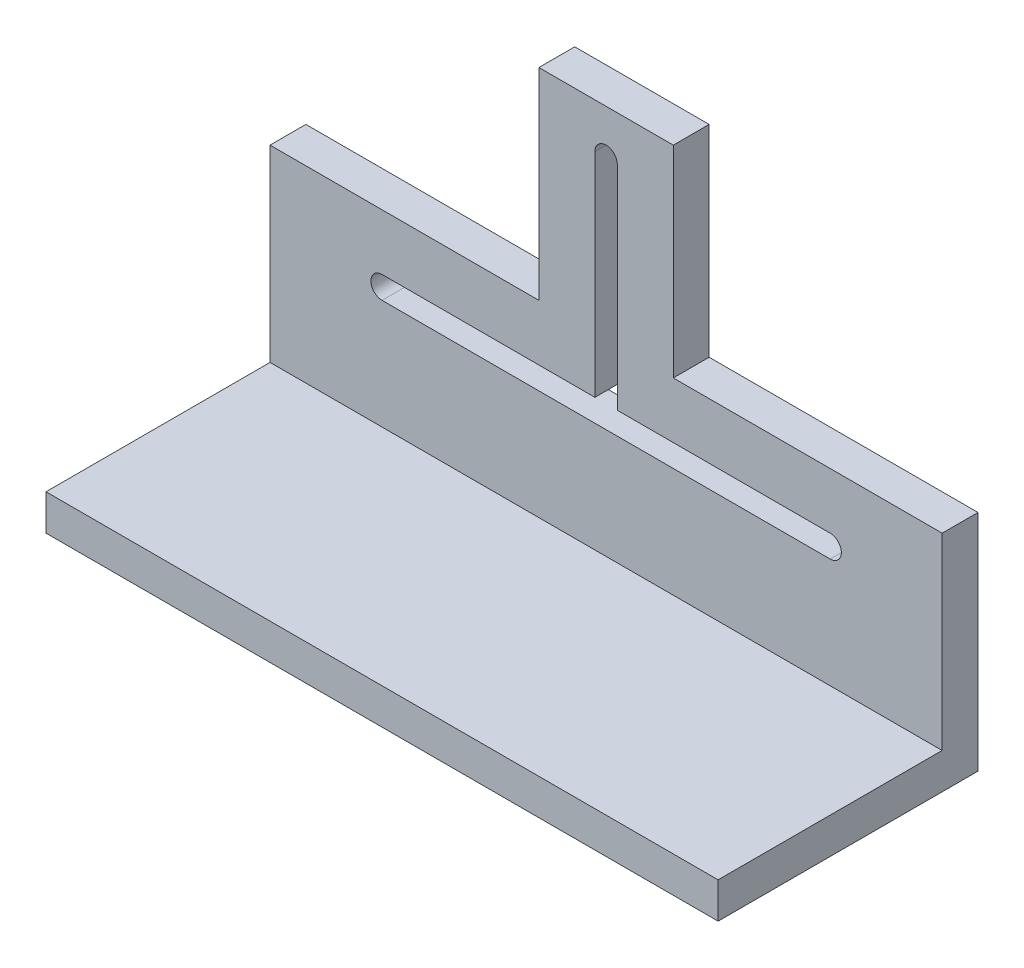
ISO-10303-21;
HEADER;
FILE_DESCRIPTION(('STEP AP214'),'2;1');
FILE_NAME('part.step','',(''),(''),'','','');
FILE_SCHEMA(('AUTOMOTIVE_DESIGN { 1 0 10303 214 1 1 1 1 }'));
ENDSEC;
DATA;
#1=APPLICATION_CONTEXT('core data for automotive mechanical design processes');
#2=APPLICATION_PROTOCOL_DEFINITION('international standard','automotive_design',2000,#1);
#3=PRODUCT_CONTEXT('',#1,'mechanical');
#4=PRODUCT('Part','Part','',(#3));
#5=PRODUCT_RELATED_PRODUCT_CATEGORY('part','',(#4));
#6=PRODUCT_DEFINITION_FORMATION('','',#4);
#7=PRODUCT_DEFINITION_CONTEXT('part definition',#1,'design');
#8=PRODUCT_DEFINITION('design','',#6,#7);
#9=PRODUCT_DEFINITION_SHAPE('','',#8);
#10=(LENGTH_UNIT() NAMED_UNIT(*) SI_UNIT(.MILLI.,.METRE.));
#11=(NAMED_UNIT(*) PLANE_ANGLE_UNIT() SI_UNIT($,.RADIAN.));
#12=(NAMED_UNIT(*) SI_UNIT($,.STERADIAN.) SOLID_ANGLE_UNIT());
#13=UNCERTAINTY_MEASURE_WITH_UNIT(LENGTH_MEASURE(1.E-05),#10,'distance_accuracy_value','');
#14=(GEOMETRIC_REPRESENTATION_CONTEXT(3) GLOBAL_UNCERTAINTY_ASSIGNED_CONTEXT((#13)) GLOBAL_UNIT_ASSIGNED_CONTEXT((#10,
#11,#12)) REPRESENTATION_CONTEXT('',''));
#15=CARTESIAN_POINT('',(0.,0.,0.));
#16=DIRECTION('',(0.,0.,1.));
#17=DIRECTION('',(1.,0.,0.));
#18=AXIS2_PLACEMENT_3D('',#15,#16,#17);
#19=CARTESIAN_POINT('',(-75.,15.,-8.));
#20=DIRECTION('',(0.,1.,0.));
#21=DIRECTION('',(-1.,0.,0.));
#22=AXIS2_PLACEMENT_3D('',#19,#20,#21);
#23=PLANE('',#22);
#24=DIRECTION('',(-1.,0.,0.));
#25=VECTOR('',#24,1.);
#26=CARTESIAN_POINT('',(-75.,15.,0.));
#27=LINE('',#26,#25);
#28=CARTESIAN_POINT('',(-15.,15.,0.));
#29=VERTEX_POINT('',#28);
#30=CARTESIAN_POINT('',(-75.,15.,0.));
#31=VERTEX_POINT('',#30);
#32=EDGE_CURVE('E237',#29,#31,#27,.T.);
#33=ORIENTED_EDGE('',*,*,#32,.F.);
#34=DIRECTION('',(0.,0.,1.));
#35=VECTOR('',#34,1.);
#36=CARTESIAN_POINT('',(-15.,15.,-8.));
#37=LINE('',#36,#35);
#38=CARTESIAN_POINT('',(-15.,15.,-8.));
#39=VERTEX_POINT('',#38);
#40=EDGE_CURVE('E11',#39,#29,#37,.T.);
#41=ORIENTED_EDGE('',*,*,#40,.F.);
#42=DIRECTION('',(-1.,0.,0.));
#43=VECTOR('',#42,1.);
#44=CARTESIAN_POINT('',(-75.,15.,-8.));
#45=LINE('',#44,#43);
#46=CARTESIAN_POINT('',(-75.,15.,-8.));
#47=VERTEX_POINT('',#46);
#48=EDGE_CURVE('E252',#39,#47,#45,.T.);
#49=ORIENTED_EDGE('',*,*,#48,.T.);
#50=DIRECTION('',(0.,0.,1.));
#51=VECTOR('',#50,1.);
#52=CARTESIAN_POINT('',(-75.,15.,-8.));
#53=LINE('',#52,#51);
#54=EDGE_CURVE('E171',#47,#31,#53,.T.);
#55=ORIENTED_EDGE('',*,*,#54,.T.);
#56=EDGE_LOOP('',(#33,#41,#49,#55));
#57=FACE_BOUND('',#56,.T.);
#58=ADVANCED_FACE('F33',(#57),#23,.T.);
#59=CARTESIAN_POINT('',(-15.,15.,-8.));
#60=DIRECTION('',(-1.,0.,0.));
#61=DIRECTION('',(0.,0.,1.));
#62=AXIS2_PLACEMENT_3D('',#59,#60,#61);
#63=PLANE('',#62);
#64=DIRECTION('',(0.,-1.,0.));
#65=VECTOR('',#64,1.);
#66=CARTESIAN_POINT('',(-15.,15.,0.));
#67=LINE('',#66,#65);
#68=CARTESIAN_POINT('',(-15.,60.,0.));
#69=VERTEX_POINT('',#68);
#70=EDGE_CURVE('E255',#69,#29,#67,.T.);
#71=ORIENTED_EDGE('',*,*,#70,.F.);
#72=DIRECTION('',(0.,0.,1.));
#73=VECTOR('',#72,1.);
#74=CARTESIAN_POINT('',(-15.,60.,-8.));
#75=LINE('',#74,#73);
#76=CARTESIAN_POINT('',(-15.,60.,-8.));
#77=VERTEX_POINT('',#76);
#78=EDGE_CURVE('E41',#77,#69,#75,.T.);
#79=ORIENTED_EDGE('',*,*,#78,.F.);
#80=DIRECTION('',(0.,-1.,0.));
#81=VECTOR('',#80,1.);
#82=CARTESIAN_POINT('',(-15.,15.,-8.));
#83=LINE('',#82,#81);
#84=EDGE_CURVE('E271',#77,#39,#83,.T.);
#85=ORIENTED_EDGE('',*,*,#84,.T.);
#86=ORIENTED_EDGE('',*,*,#40,.T.);
#87=EDGE_LOOP('',(#71,#79,#85,#86));
#88=FACE_BOUND('',#87,.T.);
#89=ADVANCED_FACE('F317',(#88),#63,.T.);
#90=CARTESIAN_POINT('',(-15.,60.,-8.));
#91=DIRECTION('',(0.,1.,0.));
#92=DIRECTION('',(-1.,0.,0.));
#93=AXIS2_PLACEMENT_3D('',#90,#91,#92);
#94=PLANE('',#93);
#95=DIRECTION('',(-1.,0.,0.));
#96=VECTOR('',#95,1.);
#97=CARTESIAN_POINT('',(-15.,60.,0.));
#98=LINE('',#97,#96);
#99=CARTESIAN_POINT('',(15.,60.,0.));
#100=VERTEX_POINT('',#99);
#101=EDGE_CURVE('E293',#100,#69,#98,.T.);
#102=ORIENTED_EDGE('',*,*,#101,.F.);
#103=DIRECTION('',(0.,0.,1.));
#104=VECTOR('',#103,1.);
#105=CARTESIAN_POINT('',(15.,60.,-8.));
#106=LINE('',#105,#104);
#107=CARTESIAN_POINT('',(15.,60.,-8.));
#108=VERTEX_POINT('',#107);
#109=EDGE_CURVE('E288',#108,#100,#106,.T.);
#110=ORIENTED_EDGE('',*,*,#109,.F.);
#111=DIRECTION('',(-1.,0.,0.));
#112=VECTOR('',#111,1.);
#113=CARTESIAN_POINT('',(-15.,60.,-8.));
#114=LINE('',#113,#112);
#115=EDGE_CURVE('E268',#108,#77,#114,.T.);
#116=ORIENTED_EDGE('',*,*,#115,.T.);
#117=ORIENTED_EDGE('',*,*,#78,.T.);
#118=EDGE_LOOP('',(#102,#110,#116,#117));
#119=FACE_BOUND('',#118,.T.);
#120=ADVANCED_FACE('F339',(#119),#94,.T.);
#121=CARTESIAN_POINT('',(15.,60.,-8.));
#122=DIRECTION('',(1.,0.,0.));
#123=DIRECTION('',(0.,1.,0.));
#124=AXIS2_PLACEMENT_3D('',#121,#122,#123);
#125=PLANE('',#124);
#126=DIRECTION('',(0.,1.,0.));
#127=VECTOR('',#126,1.);
#128=CARTESIAN_POINT('',(15.,60.,0.));
#129=LINE('',#128,#127);
#130=CARTESIAN_POINT('',(15.,15.,0.));
#131=VERTEX_POINT('',#130);
#132=EDGE_CURVE('E296',#131,#100,#129,.T.);
#133=ORIENTED_EDGE('',*,*,#132,.F.);
#134=DIRECTION('',(0.,0.,1.));
#135=VECTOR('',#134,1.);
#136=CARTESIAN_POINT('',(15.,15.,-8.));
#137=LINE('',#136,#135);
#138=CARTESIAN_POINT('',(15.,15.,-8.));
#139=VERTEX_POINT('',#138);
#140=EDGE_CURVE('E286',#139,#131,#137,.T.);
#141=ORIENTED_EDGE('',*,*,#140,.F.);
#142=DIRECTION('',(0.,1.,0.));
#143=VECTOR('',#142,1.);
#144=CARTESIAN_POINT('',(15.,60.,-8.));
#145=LINE('',#144,#143);
#146=EDGE_CURVE('E265',#139,#108,#145,.T.);
#147=ORIENTED_EDGE('',*,*,#146,.T.);
#148=ORIENTED_EDGE('',*,*,#109,.T.);
#149=EDGE_LOOP('',(#133,#141,#147,#148));
#150=FACE_BOUND('',#149,.T.);
#151=ADVANCED_FACE('F312',(#150),#125,.T.);
#152=CARTESIAN_POINT('',(15.,15.,-8.));
#153=DIRECTION('',(0.,1.,0.));
#154=DIRECTION('',(-1.,0.,0.));
#155=AXIS2_PLACEMENT_3D('',#152,#153,#154);
#156=PLANE('',#155);
#157=DIRECTION('',(-1.,0.,0.));
#158=VECTOR('',#157,1.);
#159=CARTESIAN_POINT('',(15.,15.,0.));
#160=LINE('',#159,#158);
#161=CARTESIAN_POINT('',(75.,15.,0.));
#162=VERTEX_POINT('',#161);
#163=EDGE_CURVE('E298',#162,#131,#160,.T.);
#164=ORIENTED_EDGE('',*,*,#163,.F.);
#165=DIRECTION('',(0.,0.,1.));
#166=VECTOR('',#165,1.);
#167=CARTESIAN_POINT('',(75.,15.,-8.));
#168=LINE('',#167,#166);
#169=CARTESIAN_POINT('',(75.,15.,-8.));
#170=VERTEX_POINT('',#169);
#171=EDGE_CURVE('E283',#170,#162,#168,.T.);
#172=ORIENTED_EDGE('',*,*,#171,.F.);
#173=DIRECTION('',(-1.,0.,0.));
#174=VECTOR('',#173,1.);
#175=CARTESIAN_POINT('',(15.,15.,-8.));
#176=LINE('',#175,#174);
#177=EDGE_CURVE('E262',#170,#139,#176,.T.);
#178=ORIENTED_EDGE('',*,*,#177,.T.);
#179=ORIENTED_EDGE('',*,*,#140,.T.);
#180=EDGE_LOOP('',(#164,#172,#178,#179));
#181=FACE_BOUND('',#180,.T.);
#182=ADVANCED_FACE('F308',(#181),#156,.T.);
#183=CARTESIAN_POINT('',(75.,15.,-8.));
#184=DIRECTION('',(1.,0.,0.));
#185=DIRECTION('',(0.,1.,0.));
#186=AXIS2_PLACEMENT_3D('',#183,#184,#185);
#187=PLANE('',#186);
#188=DIRECTION('',(0.,1.,0.));
#189=VECTOR('',#188,1.);
#190=CARTESIAN_POINT('',(75.,15.,0.));
#191=LINE('',#190,#189);
#192=CARTESIAN_POINT('',(75.,-27.,0.));
#193=VERTEX_POINT('',#192);
#194=EDGE_CURVE('E196',#193,#162,#191,.T.);
#195=ORIENTED_EDGE('',*,*,#194,.F.);
#196=DIRECTION('',(0.,0.,-1.));
#197=VECTOR('',#196,1.);
#198=CARTESIAN_POINT('',(75.,-27.,50.));
#199=LINE('',#198,#197);
#200=CARTESIAN_POINT('',(75.,-27.,50.));
#201=VERTEX_POINT('',#200);
#202=EDGE_CURVE('E200',#201,#193,#199,.T.);
#203=ORIENTED_EDGE('',*,*,#202,.F.);
#204=DIRECTION('',(0.,1.,0.));
#205=VECTOR('',#204,1.);
#206=CARTESIAN_POINT('',(75.,-35.,50.));
#207=LINE('',#206,#205);
#208=CARTESIAN_POINT('',(75.,-35.,50.));
#209=VERTEX_POINT('',#208);
#210=EDGE_CURVE('E178',#209,#201,#207,.T.);
#211=ORIENTED_EDGE('',*,*,#210,.F.);
#212=DIRECTION('',(0.,0.,1.));
#213=VECTOR('',#212,1.);
#214=CARTESIAN_POINT('',(75.,-35.,-8.));
#215=LINE('',#214,#213);
#216=CARTESIAN_POINT('',(75.,-35.,-8.));
#217=VERTEX_POINT('',#216);
#218=EDGE_CURVE('E170',#217,#209,#215,.T.);
#219=ORIENTED_EDGE('',*,*,#218,.F.);
#220=DIRECTION('',(0.,1.,0.));
#221=VECTOR('',#220,1.);
#222=CARTESIAN_POINT('',(75.,15.,-8.));
#223=LINE('',#222,#221);
#224=EDGE_CURVE('E259',#217,#170,#223,.T.);
#225=ORIENTED_EDGE('',*,*,#224,.T.);
#226=ORIENTED_EDGE('',*,*,#171,.T.);
#227=EDGE_LOOP('',(#195,#203,#211,#219,#225,#226));
#228=FACE_BOUND('',#227,.T.);
#229=ADVANCED_FACE('F304',(#228),#187,.T.);
#230=CARTESIAN_POINT('',(75.,-35.,-8.));
#231=DIRECTION('',(0.,-1.,0.));
#232=DIRECTION('',(1.,0.,0.));
#233=AXIS2_PLACEMENT_3D('',#230,#231,#232);
#234=PLANE('',#233);
#235=ORIENTED_EDGE('',*,*,#218,.T.);
#236=DIRECTION('',(1.,0.,0.));
#237=VECTOR('',#236,1.);
#238=CARTESIAN_POINT('',(-75.,-35.,50.));
#239=LINE('',#238,#237);
#240=CARTESIAN_POINT('',(-75.,-35.,50.));
#241=VERTEX_POINT('',#240);
#242=EDGE_CURVE('E174',#241,#209,#239,.T.);
#243=ORIENTED_EDGE('',*,*,#242,.F.);
#244=DIRECTION('',(0.,0.,1.));
#245=VECTOR('',#244,1.);
#246=CARTESIAN_POINT('',(-75.,-35.,-8.));
#247=LINE('',#246,#245);
#248=CARTESIAN_POINT('',(-75.,-35.,-8.));
#249=VERTEX_POINT('',#248);
#250=EDGE_CURVE('E158',#249,#241,#247,.T.);
#251=ORIENTED_EDGE('',*,*,#250,.F.);
#252=DIRECTION('',(1.,0.,0.));
#253=VECTOR('',#252,1.);
#254=CARTESIAN_POINT('',(75.,-35.,-8.));
#255=LINE('',#254,#253);
#256=EDGE_CURVE('E257',#249,#217,#255,.T.);
#257=ORIENTED_EDGE('',*,*,#256,.T.);
#258=EDGE_LOOP('',(#235,#243,#251,#257));
#259=FACE_BOUND('',#258,.T.);
#260=ADVANCED_FACE('F175',(#259),#234,.T.);
#261=CARTESIAN_POINT('',(-75.,-35.,-8.));
#262=DIRECTION('',(-1.,0.,0.));
#263=DIRECTION('',(0.,-1.,0.));
#264=AXIS2_PLACEMENT_3D('',#261,#262,#263);
#265=PLANE('',#264);
#266=DIRECTION('',(0.,-1.,0.));
#267=VECTOR('',#266,1.);
#268=CARTESIAN_POINT('',(-75.,-35.,0.));
#269=LINE('',#268,#267);
#270=CARTESIAN_POINT('',(-75.,-27.,0.));
#271=VERTEX_POINT('',#270);
#272=EDGE_CURVE('E276',#31,#271,#269,.T.);
#273=ORIENTED_EDGE('',*,*,#272,.F.);
#274=ORIENTED_EDGE('',*,*,#54,.F.);
#275=DIRECTION('',(0.,-1.,0.));
#276=VECTOR('',#275,1.);
#277=CARTESIAN_POINT('',(-75.,-35.,-8.));
#278=LINE('',#277,#276);
#279=EDGE_CURVE('E166',#47,#249,#278,.T.);
#280=ORIENTED_EDGE('',*,*,#279,.T.);
#281=ORIENTED_EDGE('',*,*,#250,.T.);
#282=DIRECTION('',(0.,-1.,0.));
#283=VECTOR('',#282,1.);
#284=CARTESIAN_POINT('',(-75.,-35.,50.));
#285=LINE('',#284,#283);
#286=CARTESIAN_POINT('',(-75.,-27.,50.));
#287=VERTEX_POINT('',#286);
#288=EDGE_CURVE('E164',#287,#241,#285,.T.);
#289=ORIENTED_EDGE('',*,*,#288,.F.);
#290=DIRECTION('',(0.,0.,-1.));
#291=VECTOR('',#290,1.);
#292=CARTESIAN_POINT('',(-75.,-27.,50.));
#293=LINE('',#292,#291);
#294=EDGE_CURVE('E189',#287,#271,#293,.T.);
#295=ORIENTED_EDGE('',*,*,#294,.T.);
#296=EDGE_LOOP('',(#273,#274,#280,#281,#289,#295));
#297=FACE_BOUND('',#296,.T.);
#298=ADVANCED_FACE('F161',(#297),#265,.T.);
#299=CARTESIAN_POINT('',(0.,0.,-8.));
#300=DIRECTION('',(0.,0.,1.));
#301=DIRECTION('',(1.,0.,0.));
#302=AXIS2_PLACEMENT_3D('',#299,#300,#301);
#303=PLANE('',#302);
#304=CARTESIAN_POINT('',(0.,50.,-8.));
#305=DIRECTION('',(0.,0.,1.));
#306=DIRECTION('',(-1.,0.,0.));
#307=AXIS2_PLACEMENT_3D('',#304,#305,#306);
#308=CIRCLE('',#307,2.5);
#309=CARTESIAN_POINT('',(2.5,50.,-8.));
#310=VERTEX_POINT('',#309);
#311=CARTESIAN_POINT('',(-2.5,50.,-8.));
#312=VERTEX_POINT('',#311);
#313=EDGE_CURVE('E215',#310,#312,#308,.T.);
#314=ORIENTED_EDGE('',*,*,#313,.T.);
#315=DIRECTION('',(0.,-1.,0.));
#316=VECTOR('',#315,1.);
#317=CARTESIAN_POINT('',(-2.5,2.5,-8.));
#318=LINE('',#317,#316);
#319=CARTESIAN_POINT('',(-2.5,2.5,-8.));
#320=VERTEX_POINT('',#319);
#321=EDGE_CURVE('E192',#312,#320,#318,.T.);
#322=ORIENTED_EDGE('',*,*,#321,.T.);
#323=DIRECTION('',(-1.,0.,0.));
#324=VECTOR('',#323,1.);
#325=CARTESIAN_POINT('',(-2.5,2.5,-8.));
#326=LINE('',#325,#324);
#327=CARTESIAN_POINT('',(-50.,2.49999999999999,-8.));
#328=VERTEX_POINT('',#327);
#329=EDGE_CURVE('E401',#320,#328,#326,.T.);
#330=ORIENTED_EDGE('',*,*,#329,.T.);
#331=CARTESIAN_POINT('',(-50.,0.,-8.));
#332=DIRECTION('',(0.,0.,1.));
#333=DIRECTION('',(1.,0.,0.));
#334=AXIS2_PLACEMENT_3D('',#331,#332,#333);
#335=CIRCLE('',#334,2.49999999999999);
#336=CARTESIAN_POINT('',(-50.,-2.49999999999999,-8.));
#337=VERTEX_POINT('',#336);
#338=EDGE_CURVE('E57',#328,#337,#335,.T.);
#339=ORIENTED_EDGE('',*,*,#338,.T.);
#340=DIRECTION('',(1.,0.,0.));
#341=VECTOR('',#340,1.);
#342=CARTESIAN_POINT('',(-50.,-2.49999999999999,-8.));
#343=LINE('',#342,#341);
#344=CARTESIAN_POINT('',(50.,-2.50000000000001,-8.));
#345=VERTEX_POINT('',#344);
#346=EDGE_CURVE('E413',#337,#345,#343,.T.);
#347=ORIENTED_EDGE('',*,*,#346,.T.);
#348=CARTESIAN_POINT('',(50.,0.,-8.));
#349=DIRECTION('',(0.,0.,1.));
#350=DIRECTION('',(-1.,0.,0.));
#351=AXIS2_PLACEMENT_3D('',#348,#349,#350);
#352=CIRCLE('',#351,2.50000000000001);
#353=CARTESIAN_POINT('',(50.,2.50000000000001,-8.));
#354=VERTEX_POINT('',#353);
#355=EDGE_CURVE('E408',#345,#354,#352,.T.);
#356=ORIENTED_EDGE('',*,*,#355,.T.);
#357=DIRECTION('',(-1.,0.,0.));
#358=VECTOR('',#357,1.);
#359=CARTESIAN_POINT('',(2.50000000000001,2.5,-8.));
#360=LINE('',#359,#358);
#361=CARTESIAN_POINT('',(2.50000000000001,2.5,-8.));
#362=VERTEX_POINT('',#361);
#363=EDGE_CURVE('E407',#354,#362,#360,.T.);
#364=ORIENTED_EDGE('',*,*,#363,.T.);
#365=DIRECTION('',(0.,1.,0.));
#366=VECTOR('',#365,1.);
#367=CARTESIAN_POINT('',(2.5,50.,-8.));
#368=LINE('',#367,#366);
#369=EDGE_CURVE('E406',#362,#310,#368,.T.);
#370=ORIENTED_EDGE('',*,*,#369,.T.);
#371=EDGE_LOOP('',(#314,#322,#330,#339,#347,#356,#364,#370));
#372=FACE_BOUND('',#371,.T.);
#373=ORIENTED_EDGE('',*,*,#48,.F.);
#374=ORIENTED_EDGE('',*,*,#84,.F.);
#375=ORIENTED_EDGE('',*,*,#115,.F.);
#376=ORIENTED_EDGE('',*,*,#146,.F.);
#377=ORIENTED_EDGE('',*,*,#177,.F.);
#378=ORIENTED_EDGE('',*,*,#224,.F.);
#379=ORIENTED_EDGE('',*,*,#256,.F.);
#380=ORIENTED_EDGE('',*,*,#279,.F.);
#381=EDGE_LOOP('',(#373,#374,#375,#376,#377,#378,#379,#380));
#382=FACE_BOUND('',#381,.T.);
#383=ADVANCED_FACE('F356',(#372,#382),#303,.F.);
#384=CARTESIAN_POINT('',(0.,0.,0.));
#385=DIRECTION('',(0.,0.,1.));
#386=DIRECTION('',(1.,0.,0.));
#387=AXIS2_PLACEMENT_3D('',#384,#385,#386);
#388=PLANE('',#387);
#389=DIRECTION('',(-1.,0.,0.));
#390=VECTOR('',#389,1.);
#391=CARTESIAN_POINT('',(-75.,-27.,0.));
#392=LINE('',#391,#390);
#393=EDGE_CURVE('E49',#193,#271,#392,.T.);
#394=ORIENTED_EDGE('',*,*,#393,.F.);
#395=ORIENTED_EDGE('',*,*,#194,.T.);
#396=ORIENTED_EDGE('',*,*,#163,.T.);
#397=ORIENTED_EDGE('',*,*,#132,.T.);
#398=ORIENTED_EDGE('',*,*,#101,.T.);
#399=ORIENTED_EDGE('',*,*,#70,.T.);
#400=ORIENTED_EDGE('',*,*,#32,.T.);
#401=ORIENTED_EDGE('',*,*,#272,.T.);
#402=EDGE_LOOP('',(#394,#395,#396,#397,#398,#399,#400,#401));
#403=FACE_BOUND('',#402,.T.);
#404=DIRECTION('',(0.,-1.,0.));
#405=VECTOR('',#404,1.);
#406=CARTESIAN_POINT('',(-2.5,2.5,0.));
#407=LINE('',#406,#405);
#408=CARTESIAN_POINT('',(-2.5,50.,0.));
#409=VERTEX_POINT('',#408);
#410=CARTESIAN_POINT('',(-2.5,2.5,0.));
#411=VERTEX_POINT('',#410);
#412=EDGE_CURVE('E203',#409,#411,#407,.T.);
#413=ORIENTED_EDGE('',*,*,#412,.F.);
#414=CARTESIAN_POINT('',(0.,50.,0.));
#415=DIRECTION('',(0.,0.,1.));
#416=DIRECTION('',(-1.,0.,0.));
#417=AXIS2_PLACEMENT_3D('',#414,#415,#416);
#418=CIRCLE('',#417,2.5);
#419=CARTESIAN_POINT('',(2.5,50.,0.));
#420=VERTEX_POINT('',#419);
#421=EDGE_CURVE('E232',#420,#409,#418,.T.);
#422=ORIENTED_EDGE('',*,*,#421,.F.);
#423=DIRECTION('',(0.,1.,0.));
#424=VECTOR('',#423,1.);
#425=CARTESIAN_POINT('',(2.5,50.,0.));
#426=LINE('',#425,#424);
#427=CARTESIAN_POINT('',(2.50000000000001,2.5,0.));
#428=VERTEX_POINT('',#427);
#429=EDGE_CURVE('E229',#428,#420,#426,.T.);
#430=ORIENTED_EDGE('',*,*,#429,.F.);
#431=DIRECTION('',(-1.,0.,0.));
#432=VECTOR('',#431,1.);
#433=CARTESIAN_POINT('',(2.50000000000001,2.5,0.));
#434=LINE('',#433,#432);
#435=CARTESIAN_POINT('',(50.,2.50000000000001,0.));
#436=VERTEX_POINT('',#435);
#437=EDGE_CURVE('E226',#436,#428,#434,.T.);
#438=ORIENTED_EDGE('',*,*,#437,.F.);
#439=CARTESIAN_POINT('',(50.,0.,0.));
#440=DIRECTION('',(0.,0.,1.));
#441=DIRECTION('',(-1.,0.,0.));
#442=AXIS2_PLACEMENT_3D('',#439,#440,#441);
#443=CIRCLE('',#442,2.50000000000001);
#444=CARTESIAN_POINT('',(50.,-2.50000000000001,0.));
#445=VERTEX_POINT('',#444);
#446=EDGE_CURVE('E223',#445,#436,#443,.T.);
#447=ORIENTED_EDGE('',*,*,#446,.F.);
#448=DIRECTION('',(1.,0.,0.));
#449=VECTOR('',#448,1.);
#450=CARTESIAN_POINT('',(-50.,-2.49999999999999,0.));
#451=LINE('',#450,#449);
#452=CARTESIAN_POINT('',(-50.,-2.49999999999999,0.));
#453=VERTEX_POINT('',#452);
#454=EDGE_CURVE('E220',#453,#445,#451,.T.);
#455=ORIENTED_EDGE('',*,*,#454,.F.);
#456=CARTESIAN_POINT('',(-50.,0.,0.));
#457=DIRECTION('',(0.,0.,1.));
#458=DIRECTION('',(1.,0.,0.));
#459=AXIS2_PLACEMENT_3D('',#456,#457,#458);
#460=CIRCLE('',#459,2.49999999999999);
#461=CARTESIAN_POINT('',(-50.,2.49999999999999,0.));
#462=VERTEX_POINT('',#461);
#463=EDGE_CURVE('E212',#462,#453,#460,.T.);
#464=ORIENTED_EDGE('',*,*,#463,.F.);
#465=DIRECTION('',(-1.,0.,0.));
#466=VECTOR('',#465,1.);
#467=CARTESIAN_POINT('',(-2.5,2.5,0.));
#468=LINE('',#467,#466);
#469=EDGE_CURVE('E206',#411,#462,#468,.T.);
#470=ORIENTED_EDGE('',*,*,#469,.F.);
#471=EDGE_LOOP('',(#413,#422,#430,#438,#447,#455,#464,#470));
#472=FACE_BOUND('',#471,.T.);
#473=ADVANCED_FACE('F301',(#403,#472),#388,.T.);
#474=CARTESIAN_POINT('',(-2.5,2.5,-8.));
#475=DIRECTION('',(-1.,0.,0.));
#476=DIRECTION('',(0.,-1.,0.));
#477=AXIS2_PLACEMENT_3D('',#474,#475,#476);
#478=PLANE('',#477);
#479=ORIENTED_EDGE('',*,*,#412,.T.);
#480=DIRECTION('',(0.,0.,1.));
#481=VECTOR('',#480,1.);
#482=CARTESIAN_POINT('',(-2.5,2.5,-8.));
#483=LINE('',#482,#481);
#484=EDGE_CURVE('E250',#320,#411,#483,.T.);
#485=ORIENTED_EDGE('',*,*,#484,.F.);
#486=ORIENTED_EDGE('',*,*,#321,.F.);
#487=DIRECTION('',(0.,0.,1.));
#488=VECTOR('',#487,1.);
#489=CARTESIAN_POINT('',(-2.5,50.,-8.));
#490=LINE('',#489,#488);
#491=EDGE_CURVE('E235',#312,#409,#490,.T.);
#492=ORIENTED_EDGE('',*,*,#491,.T.);
#493=EDGE_LOOP('',(#479,#485,#486,#492));
#494=FACE_BOUND('',#493,.T.);
#495=ADVANCED_FACE('F364',(#494),#478,.F.);
#496=CARTESIAN_POINT('',(0.,50.,-8.));
#497=DIRECTION('',(0.,0.,1.));
#498=DIRECTION('',(1.,0.,0.));
#499=AXIS2_PLACEMENT_3D('',#496,#497,#498);
#500=CYLINDRICAL_SURFACE('',#499,2.5);
#501=ORIENTED_EDGE('',*,*,#421,.T.);
#502=ORIENTED_EDGE('',*,*,#491,.F.);
#503=ORIENTED_EDGE('',*,*,#313,.F.);
#504=DIRECTION('',(0.,0.,1.));
#505=VECTOR('',#504,1.);
#506=CARTESIAN_POINT('',(2.5,50.,-8.));
#507=LINE('',#506,#505);
#508=EDGE_CURVE('E238',#310,#420,#507,.T.);
#509=ORIENTED_EDGE('',*,*,#508,.T.);
#510=EDGE_LOOP('',(#501,#502,#503,#509));
#511=FACE_BOUND('',#510,.T.);
#512=ADVANCED_FACE('F369',(#511),#500,.F.);
#513=CARTESIAN_POINT('',(2.5,50.,-8.));
#514=DIRECTION('',(1.,0.,0.));
#515=DIRECTION('',(0.,1.,0.));
#516=AXIS2_PLACEMENT_3D('',#513,#514,#515);
#517=PLANE('',#516);
#518=ORIENTED_EDGE('',*,*,#429,.T.);
#519=ORIENTED_EDGE('',*,*,#508,.F.);
#520=ORIENTED_EDGE('',*,*,#369,.F.);
#521=DIRECTION('',(0.,0.,1.));
#522=VECTOR('',#521,1.);
#523=CARTESIAN_POINT('',(2.50000000000001,2.5,-8.));
#524=LINE('',#523,#522);
#525=EDGE_CURVE('E240',#362,#428,#524,.T.);
#526=ORIENTED_EDGE('',*,*,#525,.T.);
#527=EDGE_LOOP('',(#518,#519,#520,#526));
#528=FACE_BOUND('',#527,.T.);
#529=ADVANCED_FACE('F384',(#528),#517,.F.);
#530=CARTESIAN_POINT('',(2.50000000000001,2.5,-8.));
#531=DIRECTION('',(0.,1.,0.));
#532=DIRECTION('',(-1.,0.,0.));
#533=AXIS2_PLACEMENT_3D('',#530,#531,#532);
#534=PLANE('',#533);
#535=ORIENTED_EDGE('',*,*,#437,.T.);
#536=ORIENTED_EDGE('',*,*,#525,.F.);
#537=ORIENTED_EDGE('',*,*,#363,.F.);
#538=DIRECTION('',(0.,0.,1.));
#539=VECTOR('',#538,1.);
#540=CARTESIAN_POINT('',(50.,2.50000000000001,-8.));
#541=LINE('',#540,#539);
#542=EDGE_CURVE('E242',#354,#436,#541,.T.);
#543=ORIENTED_EDGE('',*,*,#542,.T.);
#544=EDGE_LOOP('',(#535,#536,#537,#543));
#545=FACE_BOUND('',#544,.T.);
#546=ADVANCED_FACE('F380',(#545),#534,.F.);
#547=CARTESIAN_POINT('',(50.,0.,-8.));
#548=DIRECTION('',(0.,0.,1.));
#549=DIRECTION('',(1.,0.,0.));
#550=AXIS2_PLACEMENT_3D('',#547,#548,#549);
#551=CYLINDRICAL_SURFACE('',#550,2.50000000000001);
#552=ORIENTED_EDGE('',*,*,#446,.T.);
#553=ORIENTED_EDGE('',*,*,#542,.F.);
#554=ORIENTED_EDGE('',*,*,#355,.F.);
#555=DIRECTION('',(0.,0.,1.));
#556=VECTOR('',#555,1.);
#557=CARTESIAN_POINT('',(50.,-2.50000000000001,-8.));
#558=LINE('',#557,#556);
#559=EDGE_CURVE('E244',#345,#445,#558,.T.);
#560=ORIENTED_EDGE('',*,*,#559,.T.);
#561=EDGE_LOOP('',(#552,#553,#554,#560));
#562=FACE_BOUND('',#561,.T.);
#563=ADVANCED_FACE('F376',(#562),#551,.F.);
#564=CARTESIAN_POINT('',(-50.,-2.49999999999999,-8.));
#565=DIRECTION('',(0.,-1.,0.));
#566=DIRECTION('',(1.,0.,0.));
#567=AXIS2_PLACEMENT_3D('',#564,#565,#566);
#568=PLANE('',#567);
#569=ORIENTED_EDGE('',*,*,#454,.T.);
#570=ORIENTED_EDGE('',*,*,#559,.F.);
#571=ORIENTED_EDGE('',*,*,#346,.F.);
#572=DIRECTION('',(0.,0.,1.));
#573=VECTOR('',#572,1.);
#574=CARTESIAN_POINT('',(-50.,-2.49999999999999,-8.));
#575=LINE('',#574,#573);
#576=EDGE_CURVE('E246',#337,#453,#575,.T.);
#577=ORIENTED_EDGE('',*,*,#576,.T.);
#578=EDGE_LOOP('',(#569,#570,#571,#577));
#579=FACE_BOUND('',#578,.T.);
#580=ADVANCED_FACE('F373',(#579),#568,.F.);
#581=CARTESIAN_POINT('',(-50.,0.,-8.));
#582=DIRECTION('',(0.,0.,1.));
#583=DIRECTION('',(1.,0.,0.));
#584=AXIS2_PLACEMENT_3D('',#581,#582,#583);
#585=CYLINDRICAL_SURFACE('',#584,2.49999999999999);
#586=ORIENTED_EDGE('',*,*,#463,.T.);
#587=ORIENTED_EDGE('',*,*,#576,.F.);
#588=ORIENTED_EDGE('',*,*,#338,.F.);
#589=DIRECTION('',(0.,0.,1.));
#590=VECTOR('',#589,1.);
#591=CARTESIAN_POINT('',(-50.,2.49999999999999,-8.));
#592=LINE('',#591,#590);
#593=EDGE_CURVE('E248',#328,#462,#592,.T.);
#594=ORIENTED_EDGE('',*,*,#593,.T.);
#595=EDGE_LOOP('',(#586,#587,#588,#594));
#596=FACE_BOUND('',#595,.T.);
#597=ADVANCED_FACE('F331',(#596),#585,.F.);
#598=CARTESIAN_POINT('',(-2.5,2.5,-8.));
#599=DIRECTION('',(0.,1.,0.));
#600=DIRECTION('',(-1.,0.,0.));
#601=AXIS2_PLACEMENT_3D('',#598,#599,#600);
#602=PLANE('',#601);
#603=ORIENTED_EDGE('',*,*,#469,.T.);
#604=ORIENTED_EDGE('',*,*,#593,.F.);
#605=ORIENTED_EDGE('',*,*,#329,.F.);
#606=ORIENTED_EDGE('',*,*,#484,.T.);
#607=EDGE_LOOP('',(#603,#604,#605,#606));
#608=FACE_BOUND('',#607,.T.);
#609=ADVANCED_FACE('F324',(#608),#602,.F.);
#610=CARTESIAN_POINT('',(-75.,-27.,50.));
#611=DIRECTION('',(0.,-1.,0.));
#612=DIRECTION('',(0.,0.,-1.));
#613=AXIS2_PLACEMENT_3D('',#610,#611,#612);
#614=PLANE('',#613);
#615=ORIENTED_EDGE('',*,*,#393,.T.);
#616=ORIENTED_EDGE('',*,*,#294,.F.);
#617=DIRECTION('',(-1.,0.,0.));
#618=VECTOR('',#617,1.);
#619=CARTESIAN_POINT('',(-75.,-27.,50.));
#620=LINE('',#619,#618);
#621=EDGE_CURVE('E182',#201,#287,#620,.T.);
#622=ORIENTED_EDGE('',*,*,#621,.F.);
#623=ORIENTED_EDGE('',*,*,#202,.T.);
#624=EDGE_LOOP('',(#615,#616,#622,#623));
#625=FACE_BOUND('',#624,.T.);
#626=ADVANCED_FACE('F322',(#625),#614,.F.);
#627=CARTESIAN_POINT('',(0.,0.,50.));
#628=DIRECTION('',(0.,0.,-1.));
#629=DIRECTION('',(-1.,0.,0.));
#630=AXIS2_PLACEMENT_3D('',#627,#628,#629);
#631=PLANE('',#630);
#632=ORIENTED_EDGE('',*,*,#288,.T.);
#633=ORIENTED_EDGE('',*,*,#242,.T.);
#634=ORIENTED_EDGE('',*,*,#210,.T.);
#635=ORIENTED_EDGE('',*,*,#621,.T.);
#636=EDGE_LOOP('',(#632,#633,#634,#635));
#637=FACE_BOUND('',#636,.T.);
#638=ADVANCED_FACE('F180',(#637),#631,.F.);
#639=CLOSED_SHELL('',(#58,#89,#120,#151,#182,#229,#260,#298,#383,#473,#495,#512,#529,#546,#563,
#580,#597,#609,#626,#638));
#640=MANIFOLD_SOLID_BREP('B2',#639);
#641=ADVANCED_BREP_SHAPE_REPRESENTATION('',(#18,#640),#14);
#642=SHAPE_DEFINITION_REPRESENTATION(#9,#641);
ENDSEC;
END-ISO-10303-21;
